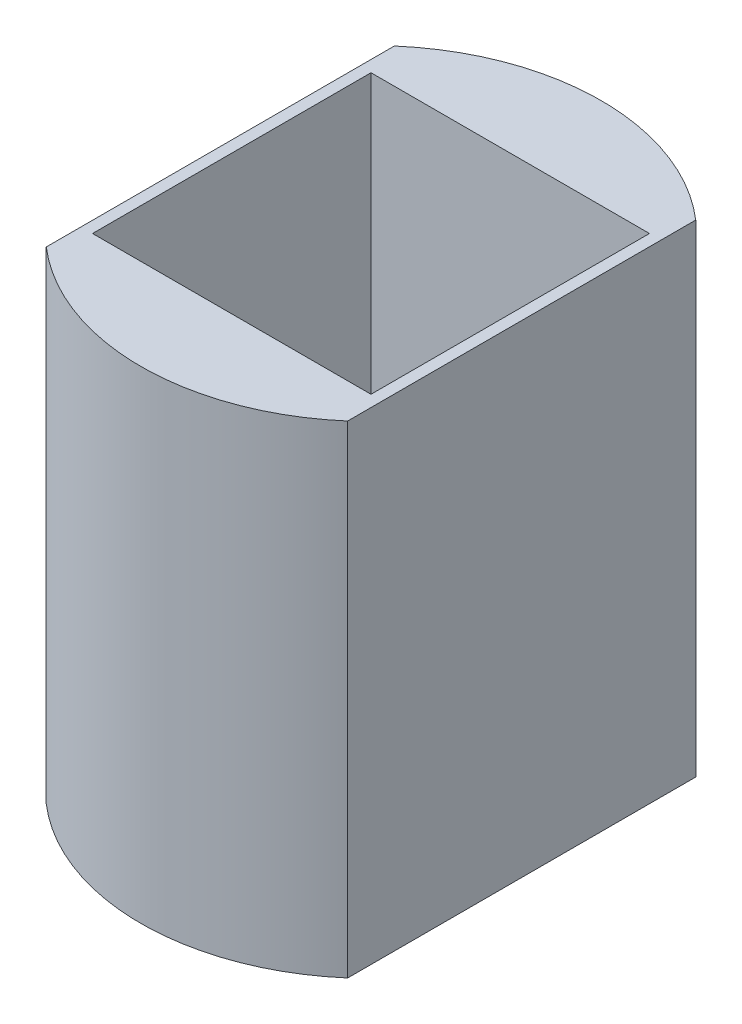
ISO-10303-21;
HEADER;
FILE_DESCRIPTION(('STEP AP214'),'2;1');
FILE_NAME('part.step','',(''),(''),'','','');
FILE_SCHEMA(('AUTOMOTIVE_DESIGN { 1 0 10303 214 1 1 1 1 }'));
ENDSEC;
DATA;
#1=APPLICATION_CONTEXT('core data for automotive mechanical design processes');
#2=APPLICATION_PROTOCOL_DEFINITION('international standard','automotive_design',2000,#1);
#3=PRODUCT_CONTEXT('',#1,'mechanical');
#4=PRODUCT('Part','Part','',(#3));
#5=PRODUCT_RELATED_PRODUCT_CATEGORY('part','',(#4));
#6=PRODUCT_DEFINITION_FORMATION('','',#4);
#7=PRODUCT_DEFINITION_CONTEXT('part definition',#1,'design');
#8=PRODUCT_DEFINITION('design','',#6,#7);
#9=PRODUCT_DEFINITION_SHAPE('','',#8);
#10=(LENGTH_UNIT() NAMED_UNIT(*) SI_UNIT(.MILLI.,.METRE.));
#11=(NAMED_UNIT(*) PLANE_ANGLE_UNIT() SI_UNIT($,.RADIAN.));
#12=(NAMED_UNIT(*) SI_UNIT($,.STERADIAN.) SOLID_ANGLE_UNIT());
#13=UNCERTAINTY_MEASURE_WITH_UNIT(LENGTH_MEASURE(1.E-05),#10,'distance_accuracy_value','');
#14=(GEOMETRIC_REPRESENTATION_CONTEXT(3) GLOBAL_UNCERTAINTY_ASSIGNED_CONTEXT((#13)) GLOBAL_UNIT_ASSIGNED_CONTEXT((#10,
#11,#12)) REPRESENTATION_CONTEXT('',''));
#15=CARTESIAN_POINT('',(0.,0.,0.));
#16=DIRECTION('',(0.,0.,1.));
#17=DIRECTION('',(1.,0.,0.));
#18=AXIS2_PLACEMENT_3D('',#15,#16,#17);
#19=CARTESIAN_POINT('',(-3.43678969934152,1.,0.));
#20=DIRECTION('',(-1.,0.,0.));
#21=DIRECTION('',(0.,0.,1.));
#22=AXIS2_PLACEMENT_3D('',#19,#20,#21);
#23=PLANE('',#22);
#24=DIRECTION('',(0.,0.,-1.));
#25=VECTOR('',#24,1.);
#26=CARTESIAN_POINT('',(-3.43678969934152,0.,0.));
#27=LINE('',#26,#25);
#28=CARTESIAN_POINT('',(-3.43678969934152,0.,3.96875));
#29=VERTEX_POINT('',#28);
#30=CARTESIAN_POINT('',(-3.43678969934152,0.,-3.96875));
#31=VERTEX_POINT('',#30);
#32=EDGE_CURVE('E113',#29,#31,#27,.T.);
#33=ORIENTED_EDGE('',*,*,#32,.F.);
#34=DIRECTION('',(0.,-1.,0.));
#35=VECTOR('',#34,1.);
#36=CARTESIAN_POINT('',(-3.43678969934152,1.,3.96875));
#37=LINE('',#36,#35);
#38=CARTESIAN_POINT('',(-3.43678969934152,11.,3.96875));
#39=VERTEX_POINT('',#38);
#40=EDGE_CURVE('E11',#39,#29,#37,.T.);
#41=ORIENTED_EDGE('',*,*,#40,.F.);
#42=DIRECTION('',(0.,0.,1.));
#43=VECTOR('',#42,1.);
#44=CARTESIAN_POINT('',(-3.43678969934152,11.,0.));
#45=LINE('',#44,#43);
#46=CARTESIAN_POINT('',(-3.43678969934152,11.,-3.96875));
#47=VERTEX_POINT('',#46);
#48=EDGE_CURVE('E135',#47,#39,#45,.T.);
#49=ORIENTED_EDGE('',*,*,#48,.F.);
#50=DIRECTION('',(0.,-1.,0.));
#51=VECTOR('',#50,1.);
#52=CARTESIAN_POINT('',(-3.43678969934152,1.,-3.96875));
#53=LINE('',#52,#51);
#54=EDGE_CURVE('E59',#47,#31,#53,.T.);
#55=ORIENTED_EDGE('',*,*,#54,.T.);
#56=EDGE_LOOP('',(#33,#41,#49,#55));
#57=FACE_BOUND('',#56,.T.);
#58=ADVANCED_FACE('F37',(#57),#23,.T.);
#59=CARTESIAN_POINT('',(0.,1.,0.));
#60=DIRECTION('',(0.,-1.,0.));
#61=DIRECTION('',(0.,0.,-1.));
#62=AXIS2_PLACEMENT_3D('',#59,#60,#61);
#63=CYLINDRICAL_SURFACE('',#62,5.25);
#64=CARTESIAN_POINT('',(0.,0.,0.));
#65=DIRECTION('',(0.,1.,0.));
#66=DIRECTION('',(0.,0.,1.));
#67=AXIS2_PLACEMENT_3D('',#64,#65,#66);
#68=CIRCLE('',#67,5.25);
#69=CARTESIAN_POINT('',(3.43678969934152,0.,3.96875));
#70=VERTEX_POINT('',#69);
#71=EDGE_CURVE('E160',#29,#70,#68,.T.);
#72=ORIENTED_EDGE('',*,*,#71,.T.);
#73=DIRECTION('',(0.,-1.,0.));
#74=VECTOR('',#73,1.);
#75=CARTESIAN_POINT('',(3.43678969934152,1.,3.96875));
#76=LINE('',#75,#74);
#77=CARTESIAN_POINT('',(3.43678969934152,11.,3.96875));
#78=VERTEX_POINT('',#77);
#79=EDGE_CURVE('E44',#78,#70,#76,.T.);
#80=ORIENTED_EDGE('',*,*,#79,.F.);
#81=CARTESIAN_POINT('',(0.,11.,0.));
#82=DIRECTION('',(0.,1.,0.));
#83=DIRECTION('',(0.,0.,1.));
#84=AXIS2_PLACEMENT_3D('',#81,#82,#83);
#85=CIRCLE('',#84,5.25);
#86=EDGE_CURVE('E138',#39,#78,#85,.T.);
#87=ORIENTED_EDGE('',*,*,#86,.F.);
#88=ORIENTED_EDGE('',*,*,#40,.T.);
#89=EDGE_LOOP('',(#72,#80,#87,#88));
#90=FACE_BOUND('',#89,.T.);
#91=ADVANCED_FACE('F183',(#90),#63,.T.);
#92=CARTESIAN_POINT('',(3.43678969934152,1.,0.));
#93=DIRECTION('',(-1.,0.,0.));
#94=DIRECTION('',(0.,0.,1.));
#95=AXIS2_PLACEMENT_3D('',#92,#93,#94);
#96=PLANE('',#95);
#97=DIRECTION('',(0.,0.,-1.));
#98=VECTOR('',#97,1.);
#99=CARTESIAN_POINT('',(3.43678969934152,0.,0.));
#100=LINE('',#99,#98);
#101=CARTESIAN_POINT('',(3.43678969934152,0.,-3.96875));
#102=VERTEX_POINT('',#101);
#103=EDGE_CURVE('E162',#70,#102,#100,.T.);
#104=ORIENTED_EDGE('',*,*,#103,.T.);
#105=DIRECTION('',(0.,-1.,0.));
#106=VECTOR('',#105,1.);
#107=CARTESIAN_POINT('',(3.43678969934152,1.,-3.96875));
#108=LINE('',#107,#106);
#109=CARTESIAN_POINT('',(3.43678969934153,11.,-3.96875));
#110=VERTEX_POINT('',#109);
#111=EDGE_CURVE('E167',#110,#102,#108,.T.);
#112=ORIENTED_EDGE('',*,*,#111,.F.);
#113=DIRECTION('',(0.,0.,-1.));
#114=VECTOR('',#113,1.);
#115=CARTESIAN_POINT('',(3.43678969934152,11.,0.));
#116=LINE('',#115,#114);
#117=EDGE_CURVE('E142',#78,#110,#116,.T.);
#118=ORIENTED_EDGE('',*,*,#117,.F.);
#119=ORIENTED_EDGE('',*,*,#79,.T.);
#120=EDGE_LOOP('',(#104,#112,#118,#119));
#121=FACE_BOUND('',#120,.T.);
#122=ADVANCED_FACE('F173',(#121),#96,.F.);
#123=CARTESIAN_POINT('',(0.,1.,0.));
#124=DIRECTION('',(0.,-1.,0.));
#125=DIRECTION('',(0.,0.,-1.));
#126=AXIS2_PLACEMENT_3D('',#123,#124,#125);
#127=CYLINDRICAL_SURFACE('',#126,5.25);
#128=CARTESIAN_POINT('',(0.,0.,0.));
#129=DIRECTION('',(0.,1.,0.));
#130=DIRECTION('',(0.,0.,1.));
#131=AXIS2_PLACEMENT_3D('',#128,#129,#130);
#132=CIRCLE('',#131,5.25);
#133=EDGE_CURVE('E164',#102,#31,#132,.T.);
#134=ORIENTED_EDGE('',*,*,#133,.T.);
#135=ORIENTED_EDGE('',*,*,#54,.F.);
#136=CARTESIAN_POINT('',(0.,11.,0.));
#137=DIRECTION('',(0.,1.,0.));
#138=DIRECTION('',(0.,0.,1.));
#139=AXIS2_PLACEMENT_3D('',#136,#137,#138);
#140=CIRCLE('',#139,5.25);
#141=EDGE_CURVE('E132',#110,#47,#140,.T.);
#142=ORIENTED_EDGE('',*,*,#141,.F.);
#143=ORIENTED_EDGE('',*,*,#111,.T.);
#144=EDGE_LOOP('',(#134,#135,#142,#143));
#145=FACE_BOUND('',#144,.T.);
#146=ADVANCED_FACE('F181',(#145),#127,.T.);
#147=CARTESIAN_POINT('',(0.,0.,0.));
#148=DIRECTION('',(0.,1.,0.));
#149=DIRECTION('',(0.,0.,1.));
#150=AXIS2_PLACEMENT_3D('',#147,#148,#149);
#151=PLANE('',#150);
#152=ORIENTED_EDGE('',*,*,#32,.T.);
#153=ORIENTED_EDGE('',*,*,#133,.F.);
#154=ORIENTED_EDGE('',*,*,#103,.F.);
#155=ORIENTED_EDGE('',*,*,#71,.F.);
#156=EDGE_LOOP('',(#152,#153,#154,#155));
#157=FACE_BOUND('',#156,.T.);
#158=ADVANCED_FACE('F179',(#157),#151,.F.);
#159=CARTESIAN_POINT('',(3.175,11.,0.));
#160=DIRECTION('',(-1.,0.,0.));
#161=DIRECTION('',(0.,0.,1.));
#162=AXIS2_PLACEMENT_3D('',#159,#160,#161);
#163=PLANE('',#162);
#164=DIRECTION('',(0.,0.,-1.));
#165=VECTOR('',#164,1.);
#166=CARTESIAN_POINT('',(3.175,1.,0.));
#167=LINE('',#166,#165);
#168=CARTESIAN_POINT('',(3.175,1.,3.175));
#169=VERTEX_POINT('',#168);
#170=CARTESIAN_POINT('',(3.175,1.,-3.175));
#171=VERTEX_POINT('',#170);
#172=EDGE_CURVE('E108',#169,#171,#167,.T.);
#173=ORIENTED_EDGE('',*,*,#172,.F.);
#174=DIRECTION('',(0.,-1.,0.));
#175=VECTOR('',#174,1.);
#176=CARTESIAN_POINT('',(3.175,11.,3.175));
#177=LINE('',#176,#175);
#178=CARTESIAN_POINT('',(3.175,11.,3.175));
#179=VERTEX_POINT('',#178);
#180=EDGE_CURVE('E103',#179,#169,#177,.T.);
#181=ORIENTED_EDGE('',*,*,#180,.F.);
#182=DIRECTION('',(0.,0.,-1.));
#183=VECTOR('',#182,1.);
#184=CARTESIAN_POINT('',(3.175,11.,0.));
#185=LINE('',#184,#183);
#186=CARTESIAN_POINT('',(3.175,11.,-3.175));
#187=VERTEX_POINT('',#186);
#188=EDGE_CURVE('E106',#179,#187,#185,.T.);
#189=ORIENTED_EDGE('',*,*,#188,.T.);
#190=DIRECTION('',(0.,-1.,0.));
#191=VECTOR('',#190,1.);
#192=CARTESIAN_POINT('',(3.175,11.,-3.175));
#193=LINE('',#192,#191);
#194=EDGE_CURVE('E145',#187,#171,#193,.T.);
#195=ORIENTED_EDGE('',*,*,#194,.T.);
#196=EDGE_LOOP('',(#173,#181,#189,#195));
#197=FACE_BOUND('',#196,.T.);
#198=ADVANCED_FACE('F105',(#197),#163,.T.);
#199=CARTESIAN_POINT('',(0.,11.,3.175));
#200=DIRECTION('',(0.,0.,-1.));
#201=DIRECTION('',(-1.,0.,0.));
#202=AXIS2_PLACEMENT_3D('',#199,#200,#201);
#203=PLANE('',#202);
#204=DIRECTION('',(1.,0.,0.));
#205=VECTOR('',#204,1.);
#206=CARTESIAN_POINT('',(0.,1.,3.175));
#207=LINE('',#206,#205);
#208=CARTESIAN_POINT('',(-3.175,1.,3.175));
#209=VERTEX_POINT('',#208);
#210=EDGE_CURVE('E147',#209,#169,#207,.T.);
#211=ORIENTED_EDGE('',*,*,#210,.F.);
#212=DIRECTION('',(0.,-1.,0.));
#213=VECTOR('',#212,1.);
#214=CARTESIAN_POINT('',(-3.175,11.,3.175));
#215=LINE('',#214,#213);
#216=CARTESIAN_POINT('',(-3.175,11.,3.175));
#217=VERTEX_POINT('',#216);
#218=EDGE_CURVE('E114',#217,#209,#215,.T.);
#219=ORIENTED_EDGE('',*,*,#218,.F.);
#220=DIRECTION('',(1.,0.,0.));
#221=VECTOR('',#220,1.);
#222=CARTESIAN_POINT('',(0.,11.,3.175));
#223=LINE('',#222,#221);
#224=EDGE_CURVE('E120',#217,#179,#223,.T.);
#225=ORIENTED_EDGE('',*,*,#224,.T.);
#226=ORIENTED_EDGE('',*,*,#180,.T.);
#227=EDGE_LOOP('',(#211,#219,#225,#226));
#228=FACE_BOUND('',#227,.T.);
#229=ADVANCED_FACE('F125',(#228),#203,.T.);
#230=CARTESIAN_POINT('',(-3.175,11.,0.));
#231=DIRECTION('',(-1.,0.,0.));
#232=DIRECTION('',(0.,0.,1.));
#233=AXIS2_PLACEMENT_3D('',#230,#231,#232);
#234=PLANE('',#233);
#235=DIRECTION('',(0.,0.,-1.));
#236=VECTOR('',#235,1.);
#237=CARTESIAN_POINT('',(-3.175,1.,0.));
#238=LINE('',#237,#236);
#239=CARTESIAN_POINT('',(-3.175,1.,-3.175));
#240=VERTEX_POINT('',#239);
#241=EDGE_CURVE('E149',#209,#240,#238,.T.);
#242=ORIENTED_EDGE('',*,*,#241,.T.);
#243=DIRECTION('',(0.,-1.,0.));
#244=VECTOR('',#243,1.);
#245=CARTESIAN_POINT('',(-3.175,11.,-3.175));
#246=LINE('',#245,#244);
#247=CARTESIAN_POINT('',(-3.175,11.,-3.175));
#248=VERTEX_POINT('',#247);
#249=EDGE_CURVE('E51',#248,#240,#246,.T.);
#250=ORIENTED_EDGE('',*,*,#249,.F.);
#251=DIRECTION('',(0.,0.,-1.));
#252=VECTOR('',#251,1.);
#253=CARTESIAN_POINT('',(-3.175,11.,0.));
#254=LINE('',#253,#252);
#255=EDGE_CURVE('E127',#217,#248,#254,.T.);
#256=ORIENTED_EDGE('',*,*,#255,.F.);
#257=ORIENTED_EDGE('',*,*,#218,.T.);
#258=EDGE_LOOP('',(#242,#250,#256,#257));
#259=FACE_BOUND('',#258,.T.);
#260=ADVANCED_FACE('F205',(#259),#234,.F.);
#261=CARTESIAN_POINT('',(0.,11.,-3.175));
#262=DIRECTION('',(0.,0.,-1.));
#263=DIRECTION('',(-1.,0.,0.));
#264=AXIS2_PLACEMENT_3D('',#261,#262,#263);
#265=PLANE('',#264);
#266=DIRECTION('',(1.,0.,0.));
#267=VECTOR('',#266,1.);
#268=CARTESIAN_POINT('',(0.,1.,-3.175));
#269=LINE('',#268,#267);
#270=EDGE_CURVE('E123',#240,#171,#269,.T.);
#271=ORIENTED_EDGE('',*,*,#270,.T.);
#272=ORIENTED_EDGE('',*,*,#194,.F.);
#273=DIRECTION('',(1.,0.,0.));
#274=VECTOR('',#273,1.);
#275=CARTESIAN_POINT('',(0.,11.,-3.175));
#276=LINE('',#275,#274);
#277=EDGE_CURVE('E121',#248,#187,#276,.T.);
#278=ORIENTED_EDGE('',*,*,#277,.F.);
#279=ORIENTED_EDGE('',*,*,#249,.T.);
#280=EDGE_LOOP('',(#271,#272,#278,#279));
#281=FACE_BOUND('',#280,.T.);
#282=ADVANCED_FACE('F208',(#281),#265,.F.);
#283=CARTESIAN_POINT('',(0.,11.,0.));
#284=DIRECTION('',(0.,1.,0.));
#285=DIRECTION('',(0.,0.,1.));
#286=AXIS2_PLACEMENT_3D('',#283,#284,#285);
#287=PLANE('',#286);
#288=ORIENTED_EDGE('',*,*,#188,.F.);
#289=ORIENTED_EDGE('',*,*,#224,.F.);
#290=ORIENTED_EDGE('',*,*,#255,.T.);
#291=ORIENTED_EDGE('',*,*,#277,.T.);
#292=EDGE_LOOP('',(#288,#289,#290,#291));
#293=FACE_BOUND('',#292,.T.);
#294=ORIENTED_EDGE('',*,*,#141,.T.);
#295=ORIENTED_EDGE('',*,*,#48,.T.);
#296=ORIENTED_EDGE('',*,*,#86,.T.);
#297=ORIENTED_EDGE('',*,*,#117,.T.);
#298=EDGE_LOOP('',(#294,#295,#296,#297));
#299=FACE_BOUND('',#298,.T.);
#300=ADVANCED_FACE('F118',(#293,#299),#287,.T.);
#301=CARTESIAN_POINT('',(0.,1.,0.));
#302=DIRECTION('',(0.,1.,0.));
#303=DIRECTION('',(0.,0.,1.));
#304=AXIS2_PLACEMENT_3D('',#301,#302,#303);
#305=PLANE('',#304);
#306=ORIENTED_EDGE('',*,*,#172,.T.);
#307=ORIENTED_EDGE('',*,*,#270,.F.);
#308=ORIENTED_EDGE('',*,*,#241,.F.);
#309=ORIENTED_EDGE('',*,*,#210,.T.);
#310=EDGE_LOOP('',(#306,#307,#308,#309));
#311=FACE_BOUND('',#310,.T.);
#312=ADVANCED_FACE('F197',(#311),#305,.T.);
#313=CLOSED_SHELL('',(#58,#91,#122,#146,#158,#198,#229,#260,#282,#300,#312));
#314=MANIFOLD_SOLID_BREP('B2',#313);
#315=ADVANCED_BREP_SHAPE_REPRESENTATION('',(#18,#314),#14);
#316=SHAPE_DEFINITION_REPRESENTATION(#9,#315);
ENDSEC;
END-ISO-10303-21;
